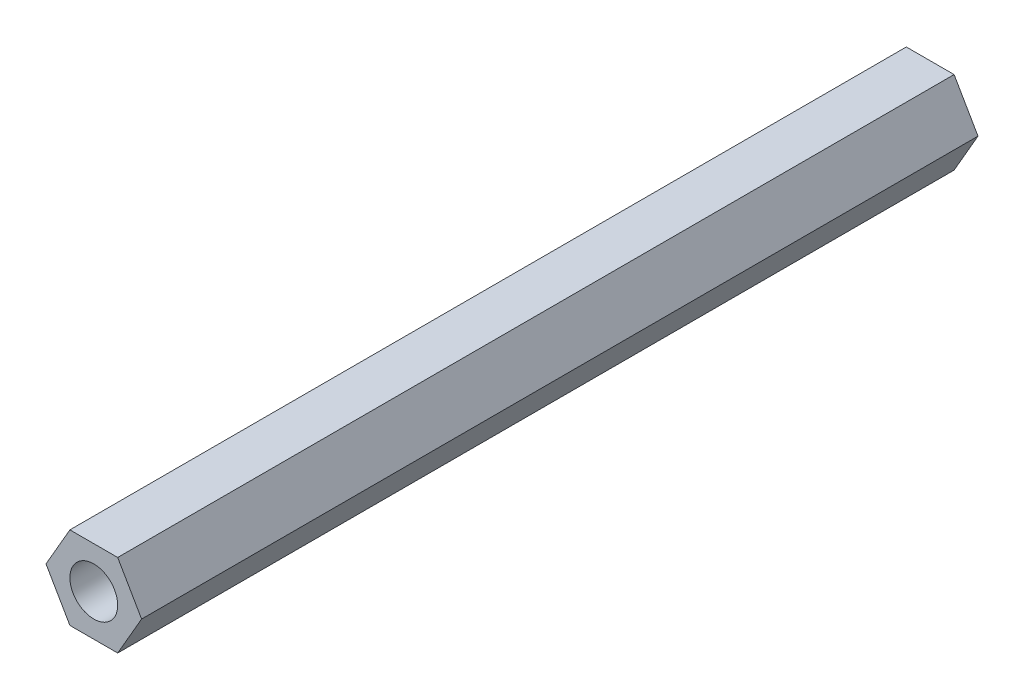
ISO-10303-21;
HEADER;
FILE_DESCRIPTION(('STEP AP214'),'2;1');
FILE_NAME('part.step','',(''),(''),'','','');
FILE_SCHEMA(('AUTOMOTIVE_DESIGN { 1 0 10303 214 1 1 1 1 }'));
ENDSEC;
DATA;
#1=APPLICATION_CONTEXT('core data for automotive mechanical design processes');
#2=APPLICATION_PROTOCOL_DEFINITION('international standard','automotive_design',2000,#1);
#3=PRODUCT_CONTEXT('',#1,'mechanical');
#4=PRODUCT('Part','Part','',(#3));
#5=PRODUCT_RELATED_PRODUCT_CATEGORY('part','',(#4));
#6=PRODUCT_DEFINITION_FORMATION('','',#4);
#7=PRODUCT_DEFINITION_CONTEXT('part definition',#1,'design');
#8=PRODUCT_DEFINITION('design','',#6,#7);
#9=PRODUCT_DEFINITION_SHAPE('','',#8);
#10=(LENGTH_UNIT() NAMED_UNIT(*) SI_UNIT(.MILLI.,.METRE.));
#11=(NAMED_UNIT(*) PLANE_ANGLE_UNIT() SI_UNIT($,.RADIAN.));
#12=(NAMED_UNIT(*) SI_UNIT($,.STERADIAN.) SOLID_ANGLE_UNIT());
#13=UNCERTAINTY_MEASURE_WITH_UNIT(LENGTH_MEASURE(1.E-05),#10,'distance_accuracy_value','');
#14=(GEOMETRIC_REPRESENTATION_CONTEXT(3) GLOBAL_UNCERTAINTY_ASSIGNED_CONTEXT((#13)) GLOBAL_UNIT_ASSIGNED_CONTEXT((#10,
#11,#12)) REPRESENTATION_CONTEXT('',''));
#15=CARTESIAN_POINT('',(0.,0.,0.));
#16=DIRECTION('',(0.,0.,1.));
#17=DIRECTION('',(1.,0.,0.));
#18=AXIS2_PLACEMENT_3D('',#15,#16,#17);
#19=CARTESIAN_POINT('',(0.,0.,70.));
#20=DIRECTION('',(0.,0.,1.));
#21=DIRECTION('',(1.,0.,0.));
#22=AXIS2_PLACEMENT_3D('',#19,#20,#21);
#23=PLANE('',#22);
#24=DIRECTION('',(0.499999999999999,0.866025403784439,0.));
#25=VECTOR('',#24,1.);
#26=CARTESIAN_POINT('',(17.2582547514158,72.1131574236625,70.));
#27=LINE('',#26,#25);
#28=CARTESIAN_POINT('',(17.2582547514158,72.1131574236625,70.));
#29=VERTEX_POINT('',#28);
#30=CARTESIAN_POINT('',(19.2582547514158,75.5772590388003,70.));
#31=VERTEX_POINT('',#30);
#32=EDGE_CURVE('E131',#29,#31,#27,.T.);
#33=ORIENTED_EDGE('',*,*,#32,.T.);
#34=DIRECTION('',(-0.499999999999998,0.86602540378444,0.));
#35=VECTOR('',#34,1.);
#36=CARTESIAN_POINT('',(19.2582547514158,75.5772590388003,70.));
#37=LINE('',#36,#35);
#38=CARTESIAN_POINT('',(17.2582547514158,79.041360653938,70.));
#39=VERTEX_POINT('',#38);
#40=EDGE_CURVE('E89',#31,#39,#37,.T.);
#41=ORIENTED_EDGE('',*,*,#40,.T.);
#42=DIRECTION('',(-1.,0.,0.));
#43=VECTOR('',#42,1.);
#44=CARTESIAN_POINT('',(17.2582547514158,79.041360653938,70.));
#45=LINE('',#44,#43);
#46=CARTESIAN_POINT('',(13.2582547514158,79.041360653938,70.));
#47=VERTEX_POINT('',#46);
#48=EDGE_CURVE('E102',#39,#47,#45,.T.);
#49=ORIENTED_EDGE('',*,*,#48,.T.);
#50=DIRECTION('',(-0.499999999999999,-0.866025403784439,0.));
#51=VECTOR('',#50,1.);
#52=CARTESIAN_POINT('',(13.2582547514158,79.041360653938,70.));
#53=LINE('',#52,#51);
#54=CARTESIAN_POINT('',(11.2582547514158,75.5772590388002,70.));
#55=VERTEX_POINT('',#54);
#56=EDGE_CURVE('E96',#47,#55,#53,.T.);
#57=ORIENTED_EDGE('',*,*,#56,.T.);
#58=DIRECTION('',(0.5,-0.866025403784438,0.));
#59=VECTOR('',#58,1.);
#60=CARTESIAN_POINT('',(11.2582547514158,75.5772590388002,70.));
#61=LINE('',#60,#59);
#62=CARTESIAN_POINT('',(13.2582547514158,72.1131574236625,70.));
#63=VERTEX_POINT('',#62);
#64=EDGE_CURVE('E100',#55,#63,#61,.T.);
#65=ORIENTED_EDGE('',*,*,#64,.T.);
#66=DIRECTION('',(1.,0.,0.));
#67=VECTOR('',#66,1.);
#68=CARTESIAN_POINT('',(13.2582547514158,72.1131574236625,70.));
#69=LINE('',#68,#67);
#70=EDGE_CURVE('E52',#63,#29,#69,.T.);
#71=ORIENTED_EDGE('',*,*,#70,.T.);
#72=EDGE_LOOP('',(#33,#41,#49,#57,#65,#71));
#73=FACE_BOUND('',#72,.T.);
#74=CARTESIAN_POINT('',(15.2582547514158,75.5772590388003,70.));
#75=DIRECTION('',(0.,0.,1.));
#76=DIRECTION('',(1.,0.,0.));
#77=AXIS2_PLACEMENT_3D('',#74,#75,#76);
#78=CIRCLE('',#77,2.);
#79=CARTESIAN_POINT('',(17.2582547514158,75.5772590388003,70.));
#80=VERTEX_POINT('',#79);
#81=EDGE_CURVE('E124',#80,#80,#78,.T.);
#82=ORIENTED_EDGE('',*,*,#81,.F.);
#83=EDGE_LOOP('',(#82));
#84=FACE_BOUND('',#83,.T.);
#85=ADVANCED_FACE('F35',(#73,#84),#23,.T.);
#86=CARTESIAN_POINT('',(0.,0.,0.));
#87=DIRECTION('',(0.,0.,1.));
#88=DIRECTION('',(1.,0.,0.));
#89=AXIS2_PLACEMENT_3D('',#86,#87,#88);
#90=PLANE('',#89);
#91=DIRECTION('',(0.499999999999999,0.866025403784439,0.));
#92=VECTOR('',#91,1.);
#93=CARTESIAN_POINT('',(17.2582547514158,72.1131574236625,0.));
#94=LINE('',#93,#92);
#95=CARTESIAN_POINT('',(17.2582547514158,72.1131574236625,0.));
#96=VERTEX_POINT('',#95);
#97=CARTESIAN_POINT('',(19.2582547514158,75.5772590388003,0.));
#98=VERTEX_POINT('',#97);
#99=EDGE_CURVE('E120',#96,#98,#94,.T.);
#100=ORIENTED_EDGE('',*,*,#99,.F.);
#101=DIRECTION('',(1.,0.,0.));
#102=VECTOR('',#101,1.);
#103=CARTESIAN_POINT('',(13.2582547514158,72.1131574236625,0.));
#104=LINE('',#103,#102);
#105=CARTESIAN_POINT('',(13.2582547514158,72.1131574236625,0.));
#106=VERTEX_POINT('',#105);
#107=EDGE_CURVE('E81',#106,#96,#104,.T.);
#108=ORIENTED_EDGE('',*,*,#107,.F.);
#109=DIRECTION('',(0.5,-0.866025403784438,0.));
#110=VECTOR('',#109,1.);
#111=CARTESIAN_POINT('',(11.2582547514158,75.5772590388002,0.));
#112=LINE('',#111,#110);
#113=CARTESIAN_POINT('',(11.2582547514158,75.5772590388002,0.));
#114=VERTEX_POINT('',#113);
#115=EDGE_CURVE('E75',#114,#106,#112,.T.);
#116=ORIENTED_EDGE('',*,*,#115,.F.);
#117=DIRECTION('',(-0.499999999999999,-0.866025403784439,0.));
#118=VECTOR('',#117,1.);
#119=CARTESIAN_POINT('',(13.2582547514158,79.041360653938,0.));
#120=LINE('',#119,#118);
#121=CARTESIAN_POINT('',(13.2582547514158,79.041360653938,0.));
#122=VERTEX_POINT('',#121);
#123=EDGE_CURVE('E110',#122,#114,#120,.T.);
#124=ORIENTED_EDGE('',*,*,#123,.F.);
#125=DIRECTION('',(-1.,0.,0.));
#126=VECTOR('',#125,1.);
#127=CARTESIAN_POINT('',(17.2582547514158,79.041360653938,0.));
#128=LINE('',#127,#126);
#129=CARTESIAN_POINT('',(17.2582547514158,79.041360653938,0.));
#130=VERTEX_POINT('',#129);
#131=EDGE_CURVE('E126',#130,#122,#128,.T.);
#132=ORIENTED_EDGE('',*,*,#131,.F.);
#133=DIRECTION('',(-0.499999999999998,0.86602540378444,0.));
#134=VECTOR('',#133,1.);
#135=CARTESIAN_POINT('',(19.2582547514158,75.5772590388003,0.));
#136=LINE('',#135,#134);
#137=EDGE_CURVE('E123',#98,#130,#136,.T.);
#138=ORIENTED_EDGE('',*,*,#137,.F.);
#139=EDGE_LOOP('',(#100,#108,#116,#124,#132,#138));
#140=FACE_BOUND('',#139,.T.);
#141=CARTESIAN_POINT('',(15.2582547514158,75.5772590388003,0.));
#142=DIRECTION('',(0.,0.,1.));
#143=DIRECTION('',(1.,0.,0.));
#144=AXIS2_PLACEMENT_3D('',#141,#142,#143);
#145=CIRCLE('',#144,2.);
#146=CARTESIAN_POINT('',(17.2582547514158,75.5772590388003,0.));
#147=VERTEX_POINT('',#146);
#148=EDGE_CURVE('E224',#147,#147,#145,.T.);
#149=ORIENTED_EDGE('',*,*,#148,.T.);
#150=EDGE_LOOP('',(#149));
#151=FACE_BOUND('',#150,.T.);
#152=ADVANCED_FACE('F140',(#140,#151),#90,.F.);
#153=CARTESIAN_POINT('',(17.2582547514158,72.1131574236625,70.));
#154=DIRECTION('',(-0.866025403784439,0.499999999999999,0.));
#155=DIRECTION('',(-0.499999999999999,-0.866025403784439,0.));
#156=AXIS2_PLACEMENT_3D('',#153,#154,#155);
#157=PLANE('',#156);
#158=ORIENTED_EDGE('',*,*,#99,.T.);
#159=DIRECTION('',(0.,0.,-1.));
#160=VECTOR('',#159,1.);
#161=CARTESIAN_POINT('',(19.2582547514158,75.5772590388003,70.));
#162=LINE('',#161,#160);
#163=EDGE_CURVE('E11',#31,#98,#162,.T.);
#164=ORIENTED_EDGE('',*,*,#163,.F.);
#165=ORIENTED_EDGE('',*,*,#32,.F.);
#166=DIRECTION('',(0.,0.,-1.));
#167=VECTOR('',#166,1.);
#168=CARTESIAN_POINT('',(17.2582547514158,72.1131574236625,70.));
#169=LINE('',#168,#167);
#170=EDGE_CURVE('E116',#29,#96,#169,.T.);
#171=ORIENTED_EDGE('',*,*,#170,.T.);
#172=EDGE_LOOP('',(#158,#164,#165,#171));
#173=FACE_BOUND('',#172,.T.);
#174=ADVANCED_FACE('F37',(#173),#157,.F.);
#175=CARTESIAN_POINT('',(19.2582547514158,75.5772590388003,70.));
#176=DIRECTION('',(-0.86602540378444,-0.499999999999998,0.));
#177=DIRECTION('',(0.499999999999998,-0.86602540378444,0.));
#178=AXIS2_PLACEMENT_3D('',#175,#176,#177);
#179=PLANE('',#178);
#180=ORIENTED_EDGE('',*,*,#137,.T.);
#181=DIRECTION('',(0.,0.,-1.));
#182=VECTOR('',#181,1.);
#183=CARTESIAN_POINT('',(17.2582547514158,79.041360653938,70.));
#184=LINE('',#183,#182);
#185=EDGE_CURVE('E44',#39,#130,#184,.T.);
#186=ORIENTED_EDGE('',*,*,#185,.F.);
#187=ORIENTED_EDGE('',*,*,#40,.F.);
#188=ORIENTED_EDGE('',*,*,#163,.T.);
#189=EDGE_LOOP('',(#180,#186,#187,#188));
#190=FACE_BOUND('',#189,.T.);
#191=ADVANCED_FACE('F165',(#190),#179,.F.);
#192=CARTESIAN_POINT('',(17.2582547514158,79.041360653938,70.));
#193=DIRECTION('',(0.,-1.,0.));
#194=DIRECTION('',(0.,0.,-1.));
#195=AXIS2_PLACEMENT_3D('',#192,#193,#194);
#196=PLANE('',#195);
#197=ORIENTED_EDGE('',*,*,#131,.T.);
#198=DIRECTION('',(0.,0.,-1.));
#199=VECTOR('',#198,1.);
#200=CARTESIAN_POINT('',(13.2582547514158,79.041360653938,70.));
#201=LINE('',#200,#199);
#202=EDGE_CURVE('E111',#47,#122,#201,.T.);
#203=ORIENTED_EDGE('',*,*,#202,.F.);
#204=ORIENTED_EDGE('',*,*,#48,.F.);
#205=ORIENTED_EDGE('',*,*,#185,.T.);
#206=EDGE_LOOP('',(#197,#203,#204,#205));
#207=FACE_BOUND('',#206,.T.);
#208=ADVANCED_FACE('F137',(#207),#196,.F.);
#209=CARTESIAN_POINT('',(13.2582547514158,79.041360653938,70.));
#210=DIRECTION('',(0.866025403784439,-0.499999999999999,0.));
#211=DIRECTION('',(0.499999999999999,0.866025403784439,0.));
#212=AXIS2_PLACEMENT_3D('',#209,#210,#211);
#213=PLANE('',#212);
#214=ORIENTED_EDGE('',*,*,#123,.T.);
#215=DIRECTION('',(0.,0.,-1.));
#216=VECTOR('',#215,1.);
#217=CARTESIAN_POINT('',(11.2582547514158,75.5772590388002,70.));
#218=LINE('',#217,#216);
#219=EDGE_CURVE('E107',#55,#114,#218,.T.);
#220=ORIENTED_EDGE('',*,*,#219,.F.);
#221=ORIENTED_EDGE('',*,*,#56,.F.);
#222=ORIENTED_EDGE('',*,*,#202,.T.);
#223=EDGE_LOOP('',(#214,#220,#221,#222));
#224=FACE_BOUND('',#223,.T.);
#225=ADVANCED_FACE('F108',(#224),#213,.F.);
#226=CARTESIAN_POINT('',(11.2582547514158,75.5772590388002,70.));
#227=DIRECTION('',(0.866025403784439,0.5,0.));
#228=DIRECTION('',(-0.5,0.866025403784439,0.));
#229=AXIS2_PLACEMENT_3D('',#226,#227,#228);
#230=PLANE('',#229);
#231=ORIENTED_EDGE('',*,*,#115,.T.);
#232=DIRECTION('',(0.,0.,-1.));
#233=VECTOR('',#232,1.);
#234=CARTESIAN_POINT('',(13.2582547514158,72.1131574236625,70.));
#235=LINE('',#234,#233);
#236=EDGE_CURVE('E112',#63,#106,#235,.T.);
#237=ORIENTED_EDGE('',*,*,#236,.F.);
#238=ORIENTED_EDGE('',*,*,#64,.F.);
#239=ORIENTED_EDGE('',*,*,#219,.T.);
#240=EDGE_LOOP('',(#231,#237,#238,#239));
#241=FACE_BOUND('',#240,.T.);
#242=ADVANCED_FACE('F114',(#241),#230,.F.);
#243=CARTESIAN_POINT('',(13.2582547514158,72.1131574236625,70.));
#244=DIRECTION('',(0.,1.,0.));
#245=DIRECTION('',(0.,0.,1.));
#246=AXIS2_PLACEMENT_3D('',#243,#244,#245);
#247=PLANE('',#246);
#248=ORIENTED_EDGE('',*,*,#107,.T.);
#249=ORIENTED_EDGE('',*,*,#170,.F.);
#250=ORIENTED_EDGE('',*,*,#70,.F.);
#251=ORIENTED_EDGE('',*,*,#236,.T.);
#252=EDGE_LOOP('',(#248,#249,#250,#251));
#253=FACE_BOUND('',#252,.T.);
#254=ADVANCED_FACE('F145',(#253),#247,.F.);
#255=CARTESIAN_POINT('',(15.2582547514158,75.5772590388003,70.));
#256=DIRECTION('',(0.,0.,-1.));
#257=DIRECTION('',(-1.,0.,0.));
#258=AXIS2_PLACEMENT_3D('',#255,#256,#257);
#259=CYLINDRICAL_SURFACE('',#258,2.);
#260=ORIENTED_EDGE('',*,*,#81,.T.);
#261=EDGE_LOOP('',(#260));
#262=FACE_BOUND('',#261,.T.);
#263=ORIENTED_EDGE('',*,*,#148,.F.);
#264=EDGE_LOOP('',(#263));
#265=FACE_BOUND('',#264,.T.);
#266=ADVANCED_FACE('F147',(#262,#265),#259,.F.);
#267=CLOSED_SHELL('',(#85,#152,#174,#191,#208,#225,#242,#254,#266));
#268=MANIFOLD_SOLID_BREP('B2',#267);
#269=ADVANCED_BREP_SHAPE_REPRESENTATION('',(#18,#268),#14);
#270=SHAPE_DEFINITION_REPRESENTATION(#9,#269);
ENDSEC;
END-ISO-10303-21;
